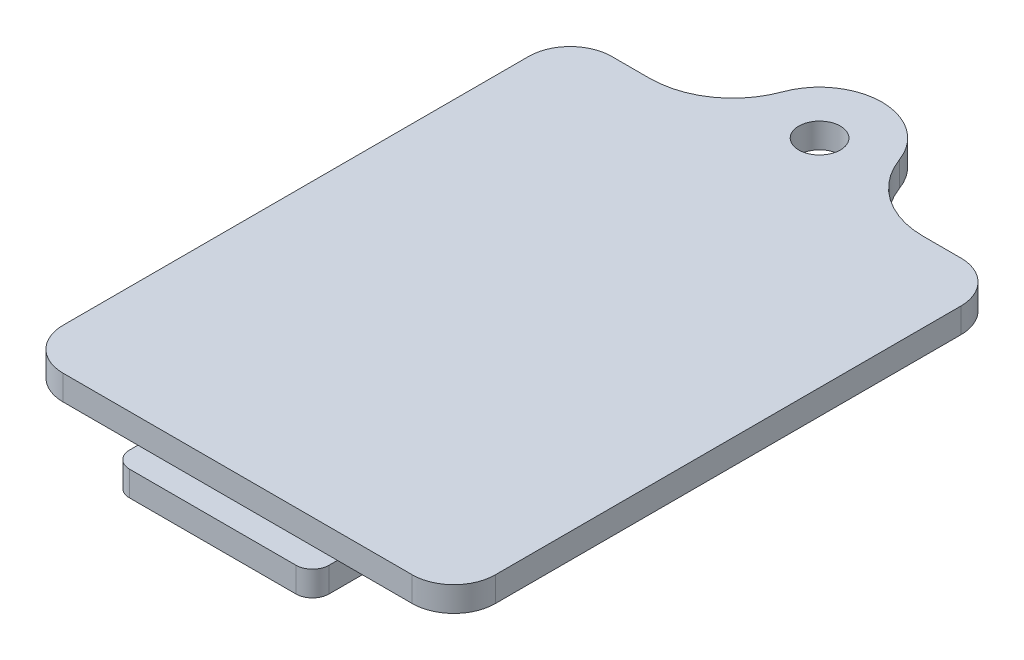
ISO-10303-21;
HEADER;
FILE_DESCRIPTION(('STEP AP214'),'2;1');
FILE_NAME('part.step','',(''),(''),'','','');
FILE_SCHEMA(('AUTOMOTIVE_DESIGN { 1 0 10303 214 1 1 1 1 }'));
ENDSEC;
DATA;
#1=APPLICATION_CONTEXT('core data for automotive mechanical design processes');
#2=APPLICATION_PROTOCOL_DEFINITION('international standard','automotive_design',2000,#1);
#3=PRODUCT_CONTEXT('',#1,'mechanical');
#4=PRODUCT('Part','Part','',(#3));
#5=PRODUCT_RELATED_PRODUCT_CATEGORY('part','',(#4));
#6=PRODUCT_DEFINITION_FORMATION('','',#4);
#7=PRODUCT_DEFINITION_CONTEXT('part definition',#1,'design');
#8=PRODUCT_DEFINITION('design','',#6,#7);
#9=PRODUCT_DEFINITION_SHAPE('','',#8);
#10=(LENGTH_UNIT() NAMED_UNIT(*) SI_UNIT(.MILLI.,.METRE.));
#11=(NAMED_UNIT(*) PLANE_ANGLE_UNIT() SI_UNIT($,.RADIAN.));
#12=(NAMED_UNIT(*) SI_UNIT($,.STERADIAN.) SOLID_ANGLE_UNIT());
#13=UNCERTAINTY_MEASURE_WITH_UNIT(LENGTH_MEASURE(1.E-05),#10,'distance_accuracy_value','');
#14=(GEOMETRIC_REPRESENTATION_CONTEXT(3) GLOBAL_UNCERTAINTY_ASSIGNED_CONTEXT((#13)) GLOBAL_UNIT_ASSIGNED_CONTEXT((#10,
#11,#12)) REPRESENTATION_CONTEXT('',''));
#15=CARTESIAN_POINT('',(0.,0.,0.));
#16=DIRECTION('',(0.,0.,1.));
#17=DIRECTION('',(1.,0.,0.));
#18=AXIS2_PLACEMENT_3D('',#15,#16,#17);
#19=CARTESIAN_POINT('',(-21.,0.,-5.));
#20=DIRECTION('',(0.,1.,0.));
#21=DIRECTION('',(0.,0.,1.));
#22=AXIS2_PLACEMENT_3D('',#19,#20,#21);
#23=PLANE('',#22);
#24=CARTESIAN_POINT('',(0.,0.,-70.));
#25=DIRECTION('',(0.,1.,0.));
#26=DIRECTION('',(0.,0.,1.));
#27=AXIS2_PLACEMENT_3D('',#24,#25,#26);
#28=CIRCLE('',#27,2.5);
#29=CARTESIAN_POINT('',(0.,0.,-67.5));
#30=VERTEX_POINT('',#29);
#31=EDGE_CURVE('E199',#30,#30,#28,.T.);
#32=ORIENTED_EDGE('',*,*,#31,.T.);
#33=EDGE_LOOP('',(#32));
#34=FACE_BOUND('',#33,.T.);
#35=DIRECTION('',(0.,0.,1.));
#36=VECTOR('',#35,1.);
#37=CARTESIAN_POINT('',(12.,0.,-7.00000000000002));
#38=LINE('',#37,#36);
#39=CARTESIAN_POINT('',(12.,0.,-7.00000000000002));
#40=VERTEX_POINT('',#39);
#41=CARTESIAN_POINT('',(12.,0.,0.));
#42=VERTEX_POINT('',#41);
#43=EDGE_CURVE('E49',#40,#42,#38,.T.);
#44=ORIENTED_EDGE('',*,*,#43,.F.);
#45=CARTESIAN_POINT('',(10.,0.,-7.00000000000002));
#46=DIRECTION('',(0.,-1.,0.));
#47=DIRECTION('',(0.,0.,1.));
#48=AXIS2_PLACEMENT_3D('',#45,#46,#47);
#49=CIRCLE('',#48,2.);
#50=CARTESIAN_POINT('',(10.,0.,-9.00000000000001));
#51=VERTEX_POINT('',#50);
#52=EDGE_CURVE('E53',#51,#40,#49,.T.);
#53=ORIENTED_EDGE('',*,*,#52,.F.);
#54=DIRECTION('',(1.,0.,0.));
#55=VECTOR('',#54,1.);
#56=CARTESIAN_POINT('',(-10.,0.,-9.00000000000001));
#57=LINE('',#56,#55);
#58=CARTESIAN_POINT('',(-10.,0.,-9.00000000000001));
#59=VERTEX_POINT('',#58);
#60=EDGE_CURVE('E342',#59,#51,#57,.T.);
#61=ORIENTED_EDGE('',*,*,#60,.F.);
#62=CARTESIAN_POINT('',(-10.,0.,-7.00000000000002));
#63=DIRECTION('',(0.,-1.,0.));
#64=DIRECTION('',(0.,0.,1.));
#65=AXIS2_PLACEMENT_3D('',#62,#63,#64);
#66=CIRCLE('',#65,2.);
#67=CARTESIAN_POINT('',(-12.,0.,-7.00000000000002));
#68=VERTEX_POINT('',#67);
#69=EDGE_CURVE('E311',#68,#59,#66,.T.);
#70=ORIENTED_EDGE('',*,*,#69,.F.);
#71=DIRECTION('',(0.,0.,-1.));
#72=VECTOR('',#71,1.);
#73=CARTESIAN_POINT('',(-12.,0.,-7.00000000000002));
#74=LINE('',#73,#72);
#75=CARTESIAN_POINT('',(-12.,0.,0.));
#76=VERTEX_POINT('',#75);
#77=EDGE_CURVE('E11',#76,#68,#74,.T.);
#78=ORIENTED_EDGE('',*,*,#77,.F.);
#79=DIRECTION('',(1.,0.,0.));
#80=VECTOR('',#79,1.);
#81=CARTESIAN_POINT('',(-21.,0.,0.));
#82=LINE('',#81,#80);
#83=CARTESIAN_POINT('',(-21.,0.,0.));
#84=VERTEX_POINT('',#83);
#85=EDGE_CURVE('E241',#84,#76,#82,.T.);
#86=ORIENTED_EDGE('',*,*,#85,.F.);
#87=CARTESIAN_POINT('',(-21.,0.,-5.));
#88=DIRECTION('',(0.,1.,0.));
#89=DIRECTION('',(0.,0.,1.));
#90=AXIS2_PLACEMENT_3D('',#87,#88,#89);
#91=CIRCLE('',#90,5.);
#92=CARTESIAN_POINT('',(-26.,0.,-5.));
#93=VERTEX_POINT('',#92);
#94=EDGE_CURVE('E209',#93,#84,#91,.T.);
#95=ORIENTED_EDGE('',*,*,#94,.F.);
#96=DIRECTION('',(0.,0.,1.));
#97=VECTOR('',#96,1.);
#98=CARTESIAN_POINT('',(-26.,0.,-61.));
#99=LINE('',#98,#97);
#100=CARTESIAN_POINT('',(-26.,0.,-61.));
#101=VERTEX_POINT('',#100);
#102=EDGE_CURVE('E215',#101,#93,#99,.T.);
#103=ORIENTED_EDGE('',*,*,#102,.F.);
#104=CARTESIAN_POINT('',(-21.,0.,-61.));
#105=DIRECTION('',(0.,1.,0.));
#106=DIRECTION('',(0.,0.,-1.));
#107=AXIS2_PLACEMENT_3D('',#104,#105,#106);
#108=CIRCLE('',#107,4.99999999999999);
#109=CARTESIAN_POINT('',(-21.,0.,-66.));
#110=VERTEX_POINT('',#109);
#111=EDGE_CURVE('E261',#110,#101,#108,.T.);
#112=ORIENTED_EDGE('',*,*,#111,.F.);
#113=DIRECTION('',(-1.,0.,0.));
#114=VECTOR('',#113,1.);
#115=CARTESIAN_POINT('',(-21.,0.,-66.));
#116=LINE('',#115,#114);
#117=CARTESIAN_POINT('',(-16.4392822227736,0.,-66.));
#118=VERTEX_POINT('',#117);
#119=EDGE_CURVE('E259',#118,#110,#116,.T.);
#120=ORIENTED_EDGE('',*,*,#119,.F.);
#121=CARTESIAN_POINT('',(-16.4392822227736,0.,-76.));
#122=DIRECTION('',(0.,-1.,0.));
#123=DIRECTION('',(0.,0.,1.));
#124=AXIS2_PLACEMENT_3D('',#121,#122,#123);
#125=CIRCLE('',#124,10.);
#126=CARTESIAN_POINT('',(-7.04540666690298,0.,-72.5714285714286));
#127=VERTEX_POINT('',#126);
#128=EDGE_CURVE('E257',#127,#118,#125,.T.);
#129=ORIENTED_EDGE('',*,*,#128,.F.);
#130=CARTESIAN_POINT('',(0.,0.,-70.));
#131=DIRECTION('',(0.,1.,0.));
#132=DIRECTION('',(0.,0.,1.));
#133=AXIS2_PLACEMENT_3D('',#130,#131,#132);
#134=CIRCLE('',#133,7.5);
#135=CARTESIAN_POINT('',(7.04540666690297,0.,-72.5714285714286));
#136=VERTEX_POINT('',#135);
#137=EDGE_CURVE('E255',#136,#127,#134,.T.);
#138=ORIENTED_EDGE('',*,*,#137,.F.);
#139=CARTESIAN_POINT('',(16.4392822227736,0.,-76.));
#140=DIRECTION('',(0.,-1.,0.));
#141=DIRECTION('',(0.,0.,-1.));
#142=AXIS2_PLACEMENT_3D('',#139,#140,#141);
#143=CIRCLE('',#142,10.);
#144=CARTESIAN_POINT('',(16.4392822227736,0.,-66.));
#145=VERTEX_POINT('',#144);
#146=EDGE_CURVE('E253',#145,#136,#143,.T.);
#147=ORIENTED_EDGE('',*,*,#146,.F.);
#148=DIRECTION('',(-1.,0.,0.));
#149=VECTOR('',#148,1.);
#150=CARTESIAN_POINT('',(16.4392822227736,0.,-66.));
#151=LINE('',#150,#149);
#152=CARTESIAN_POINT('',(21.,0.,-66.));
#153=VERTEX_POINT('',#152);
#154=EDGE_CURVE('E251',#153,#145,#151,.T.);
#155=ORIENTED_EDGE('',*,*,#154,.F.);
#156=CARTESIAN_POINT('',(21.,0.,-61.));
#157=DIRECTION('',(0.,1.,0.));
#158=DIRECTION('',(0.,0.,1.));
#159=AXIS2_PLACEMENT_3D('',#156,#157,#158);
#160=CIRCLE('',#159,5.);
#161=CARTESIAN_POINT('',(26.,0.,-61.));
#162=VERTEX_POINT('',#161);
#163=EDGE_CURVE('E249',#162,#153,#160,.T.);
#164=ORIENTED_EDGE('',*,*,#163,.F.);
#165=DIRECTION('',(0.,0.,-1.));
#166=VECTOR('',#165,1.);
#167=CARTESIAN_POINT('',(26.,0.,-61.));
#168=LINE('',#167,#166);
#169=CARTESIAN_POINT('',(26.,0.,-5.));
#170=VERTEX_POINT('',#169);
#171=EDGE_CURVE('E247',#170,#162,#168,.T.);
#172=ORIENTED_EDGE('',*,*,#171,.F.);
#173=CARTESIAN_POINT('',(21.,0.,-5.));
#174=DIRECTION('',(0.,1.,0.));
#175=DIRECTION('',(0.,0.,-1.));
#176=AXIS2_PLACEMENT_3D('',#173,#174,#175);
#177=CIRCLE('',#176,5.);
#178=CARTESIAN_POINT('',(21.,0.,0.));
#179=VERTEX_POINT('',#178);
#180=EDGE_CURVE('E244',#179,#170,#177,.T.);
#181=ORIENTED_EDGE('',*,*,#180,.F.);
#182=EDGE_CURVE('E240',#42,#179,#82,.T.);
#183=ORIENTED_EDGE('',*,*,#182,.F.);
#184=EDGE_LOOP('',(#44,#53,#61,#70,#78,#86,#95,#103,#112,#120,#129,#138,#147,#155,#164,#172,
#181,#183));
#185=FACE_BOUND('',#184,.T.);
#186=ADVANCED_FACE('F32',(#34,#185),#23,.F.);
#187=CARTESIAN_POINT('',(-21.,3.,-5.));
#188=DIRECTION('',(0.,1.,0.));
#189=DIRECTION('',(0.,0.,1.));
#190=AXIS2_PLACEMENT_3D('',#187,#188,#189);
#191=PLANE('',#190);
#192=CARTESIAN_POINT('',(-21.,3.,-5.));
#193=DIRECTION('',(0.,1.,0.));
#194=DIRECTION('',(0.,0.,1.));
#195=AXIS2_PLACEMENT_3D('',#192,#193,#194);
#196=CIRCLE('',#195,5.);
#197=CARTESIAN_POINT('',(-26.,3.,-5.));
#198=VERTEX_POINT('',#197);
#199=CARTESIAN_POINT('',(-21.,3.,0.));
#200=VERTEX_POINT('',#199);
#201=EDGE_CURVE('E211',#198,#200,#196,.T.);
#202=ORIENTED_EDGE('',*,*,#201,.T.);
#203=DIRECTION('',(1.,0.,0.));
#204=VECTOR('',#203,1.);
#205=CARTESIAN_POINT('',(-21.,3.,0.));
#206=LINE('',#205,#204);
#207=CARTESIAN_POINT('',(21.,3.,0.));
#208=VERTEX_POINT('',#207);
#209=EDGE_CURVE('E214',#200,#208,#206,.T.);
#210=ORIENTED_EDGE('',*,*,#209,.T.);
#211=CARTESIAN_POINT('',(21.,3.,-5.));
#212=DIRECTION('',(0.,1.,0.));
#213=DIRECTION('',(0.,0.,-1.));
#214=AXIS2_PLACEMENT_3D('',#211,#212,#213);
#215=CIRCLE('',#214,5.);
#216=CARTESIAN_POINT('',(26.,3.,-5.));
#217=VERTEX_POINT('',#216);
#218=EDGE_CURVE('E217',#208,#217,#215,.T.);
#219=ORIENTED_EDGE('',*,*,#218,.T.);
#220=DIRECTION('',(0.,0.,-1.));
#221=VECTOR('',#220,1.);
#222=CARTESIAN_POINT('',(26.,3.,-61.));
#223=LINE('',#222,#221);
#224=CARTESIAN_POINT('',(26.,3.,-61.));
#225=VERTEX_POINT('',#224);
#226=EDGE_CURVE('E219',#217,#225,#223,.T.);
#227=ORIENTED_EDGE('',*,*,#226,.T.);
#228=CARTESIAN_POINT('',(21.,3.,-61.));
#229=DIRECTION('',(0.,1.,0.));
#230=DIRECTION('',(0.,0.,1.));
#231=AXIS2_PLACEMENT_3D('',#228,#229,#230);
#232=CIRCLE('',#231,5.);
#233=CARTESIAN_POINT('',(21.,3.,-66.));
#234=VERTEX_POINT('',#233);
#235=EDGE_CURVE('E221',#225,#234,#232,.T.);
#236=ORIENTED_EDGE('',*,*,#235,.T.);
#237=DIRECTION('',(-1.,0.,0.));
#238=VECTOR('',#237,1.);
#239=CARTESIAN_POINT('',(16.4392822227736,3.,-66.));
#240=LINE('',#239,#238);
#241=CARTESIAN_POINT('',(16.4392822227736,3.,-66.));
#242=VERTEX_POINT('',#241);
#243=EDGE_CURVE('E223',#234,#242,#240,.T.);
#244=ORIENTED_EDGE('',*,*,#243,.T.);
#245=CARTESIAN_POINT('',(16.4392822227736,3.,-76.));
#246=DIRECTION('',(0.,-1.,0.));
#247=DIRECTION('',(0.,0.,-1.));
#248=AXIS2_PLACEMENT_3D('',#245,#246,#247);
#249=CIRCLE('',#248,10.);
#250=CARTESIAN_POINT('',(7.04540666690297,3.,-72.5714285714286));
#251=VERTEX_POINT('',#250);
#252=EDGE_CURVE('E225',#242,#251,#249,.T.);
#253=ORIENTED_EDGE('',*,*,#252,.T.);
#254=CARTESIAN_POINT('',(0.,3.,-70.));
#255=DIRECTION('',(0.,1.,0.));
#256=DIRECTION('',(0.,0.,1.));
#257=AXIS2_PLACEMENT_3D('',#254,#255,#256);
#258=CIRCLE('',#257,7.5);
#259=CARTESIAN_POINT('',(-7.04540666690298,3.,-72.5714285714286));
#260=VERTEX_POINT('',#259);
#261=EDGE_CURVE('E227',#251,#260,#258,.T.);
#262=ORIENTED_EDGE('',*,*,#261,.T.);
#263=CARTESIAN_POINT('',(-16.4392822227736,3.,-76.));
#264=DIRECTION('',(0.,-1.,0.));
#265=DIRECTION('',(0.,0.,1.));
#266=AXIS2_PLACEMENT_3D('',#263,#264,#265);
#267=CIRCLE('',#266,10.);
#268=CARTESIAN_POINT('',(-16.4392822227736,3.,-66.));
#269=VERTEX_POINT('',#268);
#270=EDGE_CURVE('E229',#260,#269,#267,.T.);
#271=ORIENTED_EDGE('',*,*,#270,.T.);
#272=DIRECTION('',(-1.,0.,0.));
#273=VECTOR('',#272,1.);
#274=CARTESIAN_POINT('',(-21.,3.,-66.));
#275=LINE('',#274,#273);
#276=CARTESIAN_POINT('',(-21.,3.,-66.));
#277=VERTEX_POINT('',#276);
#278=EDGE_CURVE('E231',#269,#277,#275,.T.);
#279=ORIENTED_EDGE('',*,*,#278,.T.);
#280=CARTESIAN_POINT('',(-21.,3.,-61.));
#281=DIRECTION('',(0.,1.,0.));
#282=DIRECTION('',(0.,0.,-1.));
#283=AXIS2_PLACEMENT_3D('',#280,#281,#282);
#284=CIRCLE('',#283,4.99999999999999);
#285=CARTESIAN_POINT('',(-26.,3.,-61.));
#286=VERTEX_POINT('',#285);
#287=EDGE_CURVE('E233',#277,#286,#284,.T.);
#288=ORIENTED_EDGE('',*,*,#287,.T.);
#289=DIRECTION('',(0.,0.,1.));
#290=VECTOR('',#289,1.);
#291=CARTESIAN_POINT('',(-26.,3.,-61.));
#292=LINE('',#291,#290);
#293=EDGE_CURVE('E235',#286,#198,#292,.T.);
#294=ORIENTED_EDGE('',*,*,#293,.T.);
#295=EDGE_LOOP('',(#202,#210,#219,#227,#236,#244,#253,#262,#271,#279,#288,#294));
#296=FACE_BOUND('',#295,.T.);
#297=CARTESIAN_POINT('',(0.,3.,-70.));
#298=DIRECTION('',(0.,1.,0.));
#299=DIRECTION('',(0.,0.,1.));
#300=AXIS2_PLACEMENT_3D('',#297,#298,#299);
#301=CIRCLE('',#300,2.5);
#302=CARTESIAN_POINT('',(0.,3.,-67.5));
#303=VERTEX_POINT('',#302);
#304=EDGE_CURVE('E202',#303,#303,#301,.T.);
#305=ORIENTED_EDGE('',*,*,#304,.F.);
#306=EDGE_LOOP('',(#305));
#307=FACE_BOUND('',#306,.T.);
#308=ADVANCED_FACE('F375',(#296,#307),#191,.T.);
#309=CARTESIAN_POINT('',(-21.,3.,-5.));
#310=DIRECTION('',(0.,-1.,0.));
#311=DIRECTION('',(0.,0.,-1.));
#312=AXIS2_PLACEMENT_3D('',#309,#310,#311);
#313=CYLINDRICAL_SURFACE('',#312,5.);
#314=ORIENTED_EDGE('',*,*,#94,.T.);
#315=DIRECTION('',(0.,-1.,0.));
#316=VECTOR('',#315,1.);
#317=CARTESIAN_POINT('',(-21.,3.,0.));
#318=LINE('',#317,#316);
#319=EDGE_CURVE('E36',#200,#84,#318,.T.);
#320=ORIENTED_EDGE('',*,*,#319,.F.);
#321=ORIENTED_EDGE('',*,*,#201,.F.);
#322=DIRECTION('',(0.,-1.,0.));
#323=VECTOR('',#322,1.);
#324=CARTESIAN_POINT('',(-26.,3.,-5.));
#325=LINE('',#324,#323);
#326=EDGE_CURVE('E237',#198,#93,#325,.T.);
#327=ORIENTED_EDGE('',*,*,#326,.T.);
#328=EDGE_LOOP('',(#314,#320,#321,#327));
#329=FACE_BOUND('',#328,.T.);
#330=ADVANCED_FACE('F34',(#329),#313,.T.);
#331=CARTESIAN_POINT('',(-21.,3.,0.));
#332=DIRECTION('',(0.,0.,-1.));
#333=DIRECTION('',(-1.,0.,0.));
#334=AXIS2_PLACEMENT_3D('',#331,#332,#333);
#335=PLANE('',#334);
#336=ORIENTED_EDGE('',*,*,#85,.T.);
#337=EDGE_CURVE('E245',#76,#42,#82,.T.);
#338=ORIENTED_EDGE('',*,*,#337,.T.);
#339=ORIENTED_EDGE('',*,*,#182,.T.);
#340=DIRECTION('',(0.,-1.,0.));
#341=VECTOR('',#340,1.);
#342=CARTESIAN_POINT('',(21.,3.,0.));
#343=LINE('',#342,#341);
#344=EDGE_CURVE('E292',#208,#179,#343,.T.);
#345=ORIENTED_EDGE('',*,*,#344,.F.);
#346=ORIENTED_EDGE('',*,*,#209,.F.);
#347=ORIENTED_EDGE('',*,*,#319,.T.);
#348=EDGE_LOOP('',(#336,#338,#339,#345,#346,#347));
#349=FACE_BOUND('',#348,.T.);
#350=ADVANCED_FACE('F301',(#349),#335,.F.);
#351=CARTESIAN_POINT('',(21.,3.,-5.));
#352=DIRECTION('',(0.,-1.,0.));
#353=DIRECTION('',(0.,0.,-1.));
#354=AXIS2_PLACEMENT_3D('',#351,#352,#353);
#355=CYLINDRICAL_SURFACE('',#354,5.);
#356=ORIENTED_EDGE('',*,*,#180,.T.);
#357=DIRECTION('',(0.,-1.,0.));
#358=VECTOR('',#357,1.);
#359=CARTESIAN_POINT('',(26.,3.,-5.));
#360=LINE('',#359,#358);
#361=EDGE_CURVE('E290',#217,#170,#360,.T.);
#362=ORIENTED_EDGE('',*,*,#361,.F.);
#363=ORIENTED_EDGE('',*,*,#218,.F.);
#364=ORIENTED_EDGE('',*,*,#344,.T.);
#365=EDGE_LOOP('',(#356,#362,#363,#364));
#366=FACE_BOUND('',#365,.T.);
#367=ADVANCED_FACE('F368',(#366),#355,.T.);
#368=CARTESIAN_POINT('',(26.,3.,-61.));
#369=DIRECTION('',(-1.,0.,0.));
#370=DIRECTION('',(0.,0.,1.));
#371=AXIS2_PLACEMENT_3D('',#368,#369,#370);
#372=PLANE('',#371);
#373=ORIENTED_EDGE('',*,*,#171,.T.);
#374=DIRECTION('',(0.,-1.,0.));
#375=VECTOR('',#374,1.);
#376=CARTESIAN_POINT('',(26.,3.,-61.));
#377=LINE('',#376,#375);
#378=EDGE_CURVE('E287',#225,#162,#377,.T.);
#379=ORIENTED_EDGE('',*,*,#378,.F.);
#380=ORIENTED_EDGE('',*,*,#226,.F.);
#381=ORIENTED_EDGE('',*,*,#361,.T.);
#382=EDGE_LOOP('',(#373,#379,#380,#381));
#383=FACE_BOUND('',#382,.T.);
#384=ADVANCED_FACE('F371',(#383),#372,.F.);
#385=CARTESIAN_POINT('',(21.,3.,-61.));
#386=DIRECTION('',(0.,-1.,0.));
#387=DIRECTION('',(0.,0.,-1.));
#388=AXIS2_PLACEMENT_3D('',#385,#386,#387);
#389=CYLINDRICAL_SURFACE('',#388,5.);
#390=ORIENTED_EDGE('',*,*,#163,.T.);
#391=DIRECTION('',(0.,-1.,0.));
#392=VECTOR('',#391,1.);
#393=CARTESIAN_POINT('',(21.,3.,-66.));
#394=LINE('',#393,#392);
#395=EDGE_CURVE('E284',#234,#153,#394,.T.);
#396=ORIENTED_EDGE('',*,*,#395,.F.);
#397=ORIENTED_EDGE('',*,*,#235,.F.);
#398=ORIENTED_EDGE('',*,*,#378,.T.);
#399=EDGE_LOOP('',(#390,#396,#397,#398));
#400=FACE_BOUND('',#399,.T.);
#401=ADVANCED_FACE('F411',(#400),#389,.T.);
#402=CARTESIAN_POINT('',(16.4392822227736,3.,-66.));
#403=DIRECTION('',(0.,0.,1.));
#404=DIRECTION('',(1.,0.,0.));
#405=AXIS2_PLACEMENT_3D('',#402,#403,#404);
#406=PLANE('',#405);
#407=ORIENTED_EDGE('',*,*,#154,.T.);
#408=DIRECTION('',(0.,-1.,0.));
#409=VECTOR('',#408,1.);
#410=CARTESIAN_POINT('',(16.4392822227736,3.,-66.));
#411=LINE('',#410,#409);
#412=EDGE_CURVE('E281',#242,#145,#411,.T.);
#413=ORIENTED_EDGE('',*,*,#412,.F.);
#414=ORIENTED_EDGE('',*,*,#243,.F.);
#415=ORIENTED_EDGE('',*,*,#395,.T.);
#416=EDGE_LOOP('',(#407,#413,#414,#415));
#417=FACE_BOUND('',#416,.T.);
#418=ADVANCED_FACE('F409',(#417),#406,.F.);
#419=CARTESIAN_POINT('',(16.4392822227736,3.,-76.));
#420=DIRECTION('',(0.,-1.,0.));
#421=DIRECTION('',(0.,0.,-1.));
#422=AXIS2_PLACEMENT_3D('',#419,#420,#421);
#423=CYLINDRICAL_SURFACE('',#422,10.);
#424=ORIENTED_EDGE('',*,*,#146,.T.);
#425=DIRECTION('',(0.,-1.,0.));
#426=VECTOR('',#425,1.);
#427=CARTESIAN_POINT('',(7.04540666690297,3.,-72.5714285714286));
#428=LINE('',#427,#426);
#429=EDGE_CURVE('E278',#251,#136,#428,.T.);
#430=ORIENTED_EDGE('',*,*,#429,.F.);
#431=ORIENTED_EDGE('',*,*,#252,.F.);
#432=ORIENTED_EDGE('',*,*,#412,.T.);
#433=EDGE_LOOP('',(#424,#430,#431,#432));
#434=FACE_BOUND('',#433,.T.);
#435=ADVANCED_FACE('F404',(#434),#423,.F.);
#436=CARTESIAN_POINT('',(0.,3.,-70.));
#437=DIRECTION('',(0.,-1.,0.));
#438=DIRECTION('',(0.,0.,-1.));
#439=AXIS2_PLACEMENT_3D('',#436,#437,#438);
#440=CYLINDRICAL_SURFACE('',#439,7.5);
#441=ORIENTED_EDGE('',*,*,#137,.T.);
#442=DIRECTION('',(0.,-1.,0.));
#443=VECTOR('',#442,1.);
#444=CARTESIAN_POINT('',(-7.04540666690298,3.,-72.5714285714286));
#445=LINE('',#444,#443);
#446=EDGE_CURVE('E275',#260,#127,#445,.T.);
#447=ORIENTED_EDGE('',*,*,#446,.F.);
#448=ORIENTED_EDGE('',*,*,#261,.F.);
#449=ORIENTED_EDGE('',*,*,#429,.T.);
#450=EDGE_LOOP('',(#441,#447,#448,#449));
#451=FACE_BOUND('',#450,.T.);
#452=ADVANCED_FACE('F399',(#451),#440,.T.);
#453=CARTESIAN_POINT('',(-16.4392822227736,3.,-76.));
#454=DIRECTION('',(0.,-1.,0.));
#455=DIRECTION('',(0.,0.,-1.));
#456=AXIS2_PLACEMENT_3D('',#453,#454,#455);
#457=CYLINDRICAL_SURFACE('',#456,10.);
#458=ORIENTED_EDGE('',*,*,#128,.T.);
#459=DIRECTION('',(0.,-1.,0.));
#460=VECTOR('',#459,1.);
#461=CARTESIAN_POINT('',(-16.4392822227736,3.,-66.));
#462=LINE('',#461,#460);
#463=EDGE_CURVE('E272',#269,#118,#462,.T.);
#464=ORIENTED_EDGE('',*,*,#463,.F.);
#465=ORIENTED_EDGE('',*,*,#270,.F.);
#466=ORIENTED_EDGE('',*,*,#446,.T.);
#467=EDGE_LOOP('',(#458,#464,#465,#466));
#468=FACE_BOUND('',#467,.T.);
#469=ADVANCED_FACE('F395',(#468),#457,.F.);
#470=CARTESIAN_POINT('',(-21.,3.,-66.));
#471=DIRECTION('',(0.,0.,1.));
#472=DIRECTION('',(1.,0.,0.));
#473=AXIS2_PLACEMENT_3D('',#470,#471,#472);
#474=PLANE('',#473);
#475=ORIENTED_EDGE('',*,*,#119,.T.);
#476=DIRECTION('',(0.,-1.,0.));
#477=VECTOR('',#476,1.);
#478=CARTESIAN_POINT('',(-21.,3.,-66.));
#479=LINE('',#478,#477);
#480=EDGE_CURVE('E269',#277,#110,#479,.T.);
#481=ORIENTED_EDGE('',*,*,#480,.F.);
#482=ORIENTED_EDGE('',*,*,#278,.F.);
#483=ORIENTED_EDGE('',*,*,#463,.T.);
#484=EDGE_LOOP('',(#475,#481,#482,#483));
#485=FACE_BOUND('',#484,.T.);
#486=ADVANCED_FACE('F390',(#485),#474,.F.);
#487=CARTESIAN_POINT('',(-21.,3.,-61.));
#488=DIRECTION('',(0.,-1.,0.));
#489=DIRECTION('',(0.,0.,-1.));
#490=AXIS2_PLACEMENT_3D('',#487,#488,#489);
#491=CYLINDRICAL_SURFACE('',#490,4.99999999999999);
#492=ORIENTED_EDGE('',*,*,#111,.T.);
#493=DIRECTION('',(0.,-1.,0.));
#494=VECTOR('',#493,1.);
#495=CARTESIAN_POINT('',(-26.,3.,-61.));
#496=LINE('',#495,#494);
#497=EDGE_CURVE('E266',#286,#101,#496,.T.);
#498=ORIENTED_EDGE('',*,*,#497,.F.);
#499=ORIENTED_EDGE('',*,*,#287,.F.);
#500=ORIENTED_EDGE('',*,*,#480,.T.);
#501=EDGE_LOOP('',(#492,#498,#499,#500));
#502=FACE_BOUND('',#501,.T.);
#503=ADVANCED_FACE('F384',(#502),#491,.T.);
#504=CARTESIAN_POINT('',(-26.,3.,-61.));
#505=DIRECTION('',(1.,0.,0.));
#506=DIRECTION('',(0.,0.,-1.));
#507=AXIS2_PLACEMENT_3D('',#504,#505,#506);
#508=PLANE('',#507);
#509=ORIENTED_EDGE('',*,*,#102,.T.);
#510=ORIENTED_EDGE('',*,*,#326,.F.);
#511=ORIENTED_EDGE('',*,*,#293,.F.);
#512=ORIENTED_EDGE('',*,*,#497,.T.);
#513=EDGE_LOOP('',(#509,#510,#511,#512));
#514=FACE_BOUND('',#513,.T.);
#515=ADVANCED_FACE('F382',(#514),#508,.F.);
#516=CARTESIAN_POINT('',(0.,3.,-70.));
#517=DIRECTION('',(0.,-1.,0.));
#518=DIRECTION('',(0.,0.,-1.));
#519=AXIS2_PLACEMENT_3D('',#516,#517,#518);
#520=CYLINDRICAL_SURFACE('',#519,2.5);
#521=ORIENTED_EDGE('',*,*,#304,.T.);
#522=EDGE_LOOP('',(#521));
#523=FACE_BOUND('',#522,.T.);
#524=ORIENTED_EDGE('',*,*,#31,.F.);
#525=EDGE_LOOP('',(#524));
#526=FACE_BOUND('',#525,.T.);
#527=ADVANCED_FACE('F431',(#523,#526),#520,.F.);
#528=CARTESIAN_POINT('',(10.,-3.,0.999999999999989));
#529=DIRECTION('',(0.,1.,0.));
#530=DIRECTION('',(0.,0.,1.));
#531=AXIS2_PLACEMENT_3D('',#528,#529,#530);
#532=CYLINDRICAL_SURFACE('',#531,2.);
#533=CARTESIAN_POINT('',(10.,0.,0.999999999999989));
#534=DIRECTION('',(0.,-1.,0.));
#535=DIRECTION('',(0.,0.,-1.));
#536=AXIS2_PLACEMENT_3D('',#533,#534,#535);
#537=CIRCLE('',#536,2.);
#538=CARTESIAN_POINT('',(12.,0.,0.99999999999999));
#539=VERTEX_POINT('',#538);
#540=CARTESIAN_POINT('',(10.,0.,2.99999999999999));
#541=VERTEX_POINT('',#540);
#542=EDGE_CURVE('E198',#539,#541,#537,.T.);
#543=ORIENTED_EDGE('',*,*,#542,.T.);
#544=DIRECTION('',(0.,1.,0.));
#545=VECTOR('',#544,1.);
#546=CARTESIAN_POINT('',(10.,-3.,2.99999999999999));
#547=LINE('',#546,#545);
#548=CARTESIAN_POINT('',(10.,-3.,2.99999999999999));
#549=VERTEX_POINT('',#548);
#550=EDGE_CURVE('E179',#549,#541,#547,.T.);
#551=ORIENTED_EDGE('',*,*,#550,.F.);
#552=CARTESIAN_POINT('',(10.,-3.,0.999999999999989));
#553=DIRECTION('',(0.,-1.,0.));
#554=DIRECTION('',(0.,0.,-1.));
#555=AXIS2_PLACEMENT_3D('',#552,#553,#554);
#556=CIRCLE('',#555,2.);
#557=CARTESIAN_POINT('',(12.,-3.,0.99999999999999));
#558=VERTEX_POINT('',#557);
#559=EDGE_CURVE('E186',#558,#549,#556,.T.);
#560=ORIENTED_EDGE('',*,*,#559,.F.);
#561=DIRECTION('',(0.,1.,0.));
#562=VECTOR('',#561,1.);
#563=CARTESIAN_POINT('',(12.,-3.,0.99999999999999));
#564=LINE('',#563,#562);
#565=EDGE_CURVE('E337',#558,#539,#564,.T.);
#566=ORIENTED_EDGE('',*,*,#565,.T.);
#567=EDGE_LOOP('',(#543,#551,#560,#566));
#568=FACE_BOUND('',#567,.T.);
#569=ADVANCED_FACE('F196',(#568),#532,.T.);
#570=CARTESIAN_POINT('',(-10.,-3.,2.99999999999999));
#571=DIRECTION('',(0.,0.,-1.));
#572=DIRECTION('',(-1.,0.,0.));
#573=AXIS2_PLACEMENT_3D('',#570,#571,#572);
#574=PLANE('',#573);
#575=DIRECTION('',(-1.,0.,0.));
#576=VECTOR('',#575,1.);
#577=CARTESIAN_POINT('',(-10.,0.,2.99999999999999));
#578=LINE('',#577,#576);
#579=CARTESIAN_POINT('',(-10.,0.,2.99999999999999));
#580=VERTEX_POINT('',#579);
#581=EDGE_CURVE('E347',#541,#580,#578,.T.);
#582=ORIENTED_EDGE('',*,*,#581,.T.);
#583=DIRECTION('',(0.,1.,0.));
#584=VECTOR('',#583,1.);
#585=CARTESIAN_POINT('',(-10.,-3.,2.99999999999999));
#586=LINE('',#585,#584);
#587=CARTESIAN_POINT('',(-10.,-3.,2.99999999999999));
#588=VERTEX_POINT('',#587);
#589=EDGE_CURVE('E182',#588,#580,#586,.T.);
#590=ORIENTED_EDGE('',*,*,#589,.F.);
#591=DIRECTION('',(-1.,0.,0.));
#592=VECTOR('',#591,1.);
#593=CARTESIAN_POINT('',(-10.,-3.,2.99999999999999));
#594=LINE('',#593,#592);
#595=EDGE_CURVE('E175',#549,#588,#594,.T.);
#596=ORIENTED_EDGE('',*,*,#595,.F.);
#597=ORIENTED_EDGE('',*,*,#550,.T.);
#598=EDGE_LOOP('',(#582,#590,#596,#597));
#599=FACE_BOUND('',#598,.T.);
#600=ADVANCED_FACE('F177',(#599),#574,.F.);
#601=CARTESIAN_POINT('',(-10.,-3.,0.999999999999987));
#602=DIRECTION('',(0.,1.,0.));
#603=DIRECTION('',(0.,0.,1.));
#604=AXIS2_PLACEMENT_3D('',#601,#602,#603);
#605=CYLINDRICAL_SURFACE('',#604,2.);
#606=CARTESIAN_POINT('',(-10.,0.,0.999999999999987));
#607=DIRECTION('',(0.,-1.,0.));
#608=DIRECTION('',(0.,0.,-1.));
#609=AXIS2_PLACEMENT_3D('',#606,#607,#608);
#610=CIRCLE('',#609,2.);
#611=CARTESIAN_POINT('',(-12.,0.,0.999999999999987));
#612=VERTEX_POINT('',#611);
#613=EDGE_CURVE('E345',#580,#612,#610,.T.);
#614=ORIENTED_EDGE('',*,*,#613,.T.);
#615=DIRECTION('',(0.,1.,0.));
#616=VECTOR('',#615,1.);
#617=CARTESIAN_POINT('',(-12.,-3.,0.999999999999987));
#618=LINE('',#617,#616);
#619=CARTESIAN_POINT('',(-12.,-3.,0.999999999999987));
#620=VERTEX_POINT('',#619);
#621=EDGE_CURVE('E204',#620,#612,#618,.T.);
#622=ORIENTED_EDGE('',*,*,#621,.F.);
#623=CARTESIAN_POINT('',(-10.,-3.,0.999999999999987));
#624=DIRECTION('',(0.,-1.,0.));
#625=DIRECTION('',(0.,0.,-1.));
#626=AXIS2_PLACEMENT_3D('',#623,#624,#625);
#627=CIRCLE('',#626,2.);
#628=EDGE_CURVE('E185',#588,#620,#627,.T.);
#629=ORIENTED_EDGE('',*,*,#628,.F.);
#630=ORIENTED_EDGE('',*,*,#589,.T.);
#631=EDGE_LOOP('',(#614,#622,#629,#630));
#632=FACE_BOUND('',#631,.T.);
#633=ADVANCED_FACE('F360',(#632),#605,.T.);
#634=CARTESIAN_POINT('',(-12.,-3.,-7.00000000000002));
#635=DIRECTION('',(1.,0.,0.));
#636=DIRECTION('',(0.,0.,-1.));
#637=AXIS2_PLACEMENT_3D('',#634,#635,#636);
#638=PLANE('',#637);
#639=EDGE_CURVE('E42',#612,#76,#74,.T.);
#640=ORIENTED_EDGE('',*,*,#639,.T.);
#641=ORIENTED_EDGE('',*,*,#77,.T.);
#642=DIRECTION('',(0.,1.,0.));
#643=VECTOR('',#642,1.);
#644=CARTESIAN_POINT('',(-12.,-3.,-7.00000000000002));
#645=LINE('',#644,#643);
#646=CARTESIAN_POINT('',(-12.,-3.,-7.00000000000002));
#647=VERTEX_POINT('',#646);
#648=EDGE_CURVE('E318',#647,#68,#645,.T.);
#649=ORIENTED_EDGE('',*,*,#648,.F.);
#650=DIRECTION('',(0.,0.,-1.));
#651=VECTOR('',#650,1.);
#652=CARTESIAN_POINT('',(-12.,-3.,-7.00000000000002));
#653=LINE('',#652,#651);
#654=EDGE_CURVE('E356',#620,#647,#653,.T.);
#655=ORIENTED_EDGE('',*,*,#654,.F.);
#656=ORIENTED_EDGE('',*,*,#621,.T.);
#657=EDGE_LOOP('',(#640,#641,#649,#655,#656));
#658=FACE_BOUND('',#657,.T.);
#659=ADVANCED_FACE('F316',(#658),#638,.F.);
#660=CARTESIAN_POINT('',(-10.,-3.,-7.00000000000002));
#661=DIRECTION('',(0.,1.,0.));
#662=DIRECTION('',(0.,0.,1.));
#663=AXIS2_PLACEMENT_3D('',#660,#661,#662);
#664=CYLINDRICAL_SURFACE('',#663,2.);
#665=ORIENTED_EDGE('',*,*,#69,.T.);
#666=DIRECTION('',(0.,1.,0.));
#667=VECTOR('',#666,1.);
#668=CARTESIAN_POINT('',(-10.,-3.,-9.00000000000001));
#669=LINE('',#668,#667);
#670=CARTESIAN_POINT('',(-10.,-3.,-9.00000000000001));
#671=VERTEX_POINT('',#670);
#672=EDGE_CURVE('E327',#671,#59,#669,.T.);
#673=ORIENTED_EDGE('',*,*,#672,.F.);
#674=CARTESIAN_POINT('',(-10.,-3.,-7.00000000000002));
#675=DIRECTION('',(0.,-1.,0.));
#676=DIRECTION('',(0.,0.,1.));
#677=AXIS2_PLACEMENT_3D('',#674,#675,#676);
#678=CIRCLE('',#677,2.);
#679=EDGE_CURVE('E326',#647,#671,#678,.T.);
#680=ORIENTED_EDGE('',*,*,#679,.F.);
#681=ORIENTED_EDGE('',*,*,#648,.T.);
#682=EDGE_LOOP('',(#665,#673,#680,#681));
#683=FACE_BOUND('',#682,.T.);
#684=ADVANCED_FACE('F323',(#683),#664,.T.);
#685=CARTESIAN_POINT('',(-10.,-3.,-9.00000000000001));
#686=DIRECTION('',(0.,0.,1.));
#687=DIRECTION('',(1.,0.,0.));
#688=AXIS2_PLACEMENT_3D('',#685,#686,#687);
#689=PLANE('',#688);
#690=ORIENTED_EDGE('',*,*,#60,.T.);
#691=DIRECTION('',(0.,1.,0.));
#692=VECTOR('',#691,1.);
#693=CARTESIAN_POINT('',(10.,-3.,-9.00000000000001));
#694=LINE('',#693,#692);
#695=CARTESIAN_POINT('',(10.,-3.,-9.00000000000001));
#696=VERTEX_POINT('',#695);
#697=EDGE_CURVE('E329',#696,#51,#694,.T.);
#698=ORIENTED_EDGE('',*,*,#697,.F.);
#699=DIRECTION('',(1.,0.,0.));
#700=VECTOR('',#699,1.);
#701=CARTESIAN_POINT('',(-10.,-3.,-9.00000000000001));
#702=LINE('',#701,#700);
#703=EDGE_CURVE('E353',#671,#696,#702,.T.);
#704=ORIENTED_EDGE('',*,*,#703,.F.);
#705=ORIENTED_EDGE('',*,*,#672,.T.);
#706=EDGE_LOOP('',(#690,#698,#704,#705));
#707=FACE_BOUND('',#706,.T.);
#708=ADVANCED_FACE('F502',(#707),#689,.F.);
#709=CARTESIAN_POINT('',(10.,-3.,-7.00000000000002));
#710=DIRECTION('',(0.,1.,0.));
#711=DIRECTION('',(0.,0.,1.));
#712=AXIS2_PLACEMENT_3D('',#709,#710,#711);
#713=CYLINDRICAL_SURFACE('',#712,2.);
#714=ORIENTED_EDGE('',*,*,#52,.T.);
#715=DIRECTION('',(0.,1.,0.));
#716=VECTOR('',#715,1.);
#717=CARTESIAN_POINT('',(12.,-3.,-7.00000000000002));
#718=LINE('',#717,#716);
#719=CARTESIAN_POINT('',(12.,-3.,-7.00000000000002));
#720=VERTEX_POINT('',#719);
#721=EDGE_CURVE('E334',#720,#40,#718,.T.);
#722=ORIENTED_EDGE('',*,*,#721,.F.);
#723=CARTESIAN_POINT('',(10.,-3.,-7.00000000000002));
#724=DIRECTION('',(0.,-1.,0.));
#725=DIRECTION('',(0.,0.,1.));
#726=AXIS2_PLACEMENT_3D('',#723,#724,#725);
#727=CIRCLE('',#726,2.);
#728=EDGE_CURVE('E351',#696,#720,#727,.T.);
#729=ORIENTED_EDGE('',*,*,#728,.F.);
#730=ORIENTED_EDGE('',*,*,#697,.T.);
#731=EDGE_LOOP('',(#714,#722,#729,#730));
#732=FACE_BOUND('',#731,.T.);
#733=ADVANCED_FACE('F509',(#732),#713,.T.);
#734=CARTESIAN_POINT('',(12.,-3.,-7.00000000000002));
#735=DIRECTION('',(-1.,0.,0.));
#736=DIRECTION('',(0.,0.,1.));
#737=AXIS2_PLACEMENT_3D('',#734,#735,#736);
#738=PLANE('',#737);
#739=ORIENTED_EDGE('',*,*,#43,.T.);
#740=EDGE_CURVE('E340',#42,#539,#38,.T.);
#741=ORIENTED_EDGE('',*,*,#740,.T.);
#742=ORIENTED_EDGE('',*,*,#565,.F.);
#743=DIRECTION('',(0.,0.,1.));
#744=VECTOR('',#743,1.);
#745=CARTESIAN_POINT('',(12.,-3.,-7.00000000000002));
#746=LINE('',#745,#744);
#747=EDGE_CURVE('E191',#720,#558,#746,.T.);
#748=ORIENTED_EDGE('',*,*,#747,.F.);
#749=ORIENTED_EDGE('',*,*,#721,.T.);
#750=EDGE_LOOP('',(#739,#741,#742,#748,#749));
#751=FACE_BOUND('',#750,.T.);
#752=ADVANCED_FACE('F517',(#751),#738,.F.);
#753=CARTESIAN_POINT('',(10.,-3.,0.999999999999989));
#754=DIRECTION('',(0.,-1.,0.));
#755=DIRECTION('',(0.,0.,-1.));
#756=AXIS2_PLACEMENT_3D('',#753,#754,#755);
#757=PLANE('',#756);
#758=ORIENTED_EDGE('',*,*,#559,.T.);
#759=ORIENTED_EDGE('',*,*,#595,.T.);
#760=ORIENTED_EDGE('',*,*,#628,.T.);
#761=ORIENTED_EDGE('',*,*,#654,.T.);
#762=ORIENTED_EDGE('',*,*,#679,.T.);
#763=ORIENTED_EDGE('',*,*,#703,.T.);
#764=ORIENTED_EDGE('',*,*,#728,.T.);
#765=ORIENTED_EDGE('',*,*,#747,.T.);
#766=EDGE_LOOP('',(#758,#759,#760,#761,#762,#763,#764,#765));
#767=FACE_BOUND('',#766,.T.);
#768=ADVANCED_FACE('F189',(#767),#757,.T.);
#769=CARTESIAN_POINT('',(10.,0.,0.999999999999989));
#770=DIRECTION('',(0.,-1.,0.));
#771=DIRECTION('',(0.,0.,-1.));
#772=AXIS2_PLACEMENT_3D('',#769,#770,#771);
#773=PLANE('',#772);
#774=ORIENTED_EDGE('',*,*,#337,.F.);
#775=ORIENTED_EDGE('',*,*,#639,.F.);
#776=ORIENTED_EDGE('',*,*,#613,.F.);
#777=ORIENTED_EDGE('',*,*,#581,.F.);
#778=ORIENTED_EDGE('',*,*,#542,.F.);
#779=ORIENTED_EDGE('',*,*,#740,.F.);
#780=EDGE_LOOP('',(#774,#775,#776,#777,#778,#779));
#781=FACE_BOUND('',#780,.T.);
#782=ADVANCED_FACE('F363',(#781),#773,.F.);
#783=CLOSED_SHELL('',(#186,#308,#330,#350,#367,#384,#401,#418,#435,#452,#469,#486,#503,#515,
#527,#569,#600,#633,#659,#684,#708,#733,#752,#768,#782));
#784=MANIFOLD_SOLID_BREP('B2',#783);
#785=ADVANCED_BREP_SHAPE_REPRESENTATION('',(#18,#784),#14);
#786=SHAPE_DEFINITION_REPRESENTATION(#9,#785);
ENDSEC;
END-ISO-10303-21;
